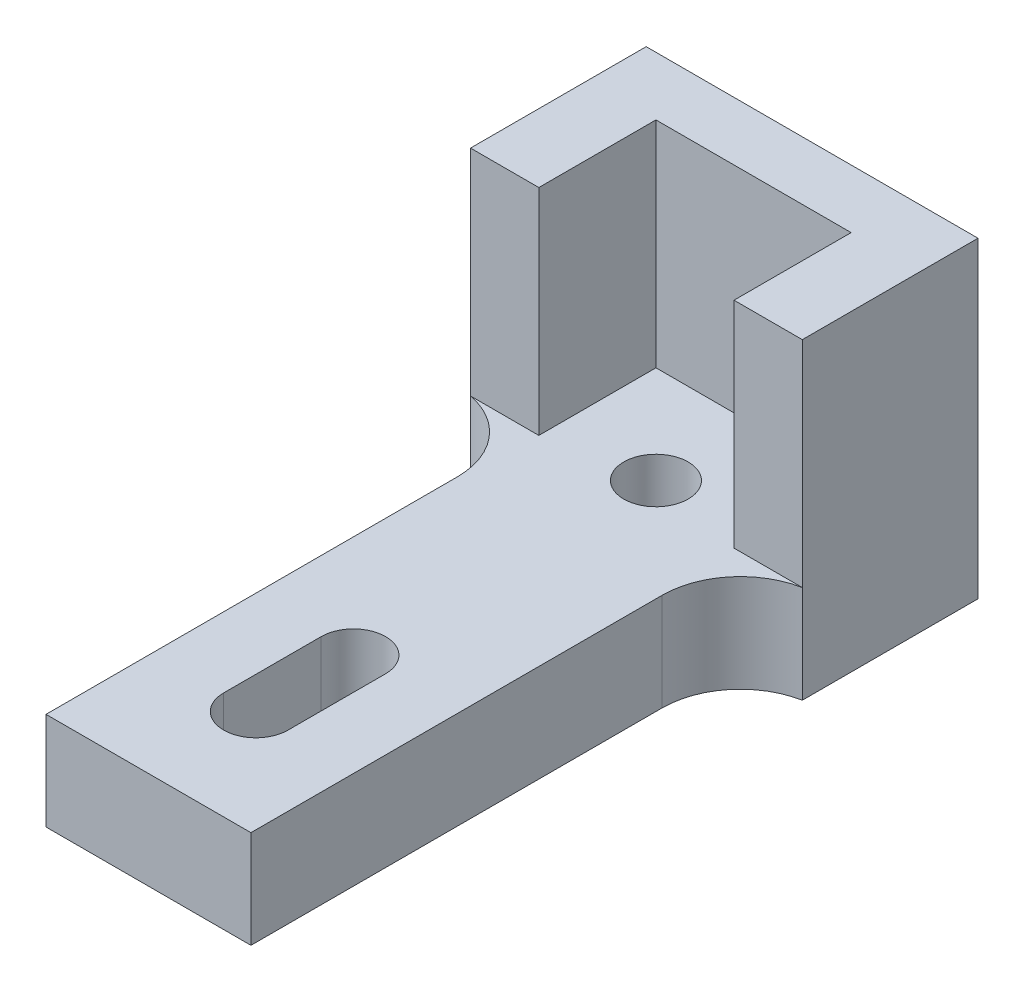
ISO-10303-21;
HEADER;
FILE_DESCRIPTION(('STEP AP214'),'2;1');
FILE_NAME('part.step','',(''),(''),'','','');
FILE_SCHEMA(('AUTOMOTIVE_DESIGN { 1 0 10303 214 1 1 1 1 }'));
ENDSEC;
DATA;
#1=APPLICATION_CONTEXT('core data for automotive mechanical design processes');
#2=APPLICATION_PROTOCOL_DEFINITION('international standard','automotive_design',2000,#1);
#3=PRODUCT_CONTEXT('',#1,'mechanical');
#4=PRODUCT('Part','Part','',(#3));
#5=PRODUCT_RELATED_PRODUCT_CATEGORY('part','',(#4));
#6=PRODUCT_DEFINITION_FORMATION('','',#4);
#7=PRODUCT_DEFINITION_CONTEXT('part definition',#1,'design');
#8=PRODUCT_DEFINITION('design','',#6,#7);
#9=PRODUCT_DEFINITION_SHAPE('','',#8);
#10=(LENGTH_UNIT() NAMED_UNIT(*) SI_UNIT(.MILLI.,.METRE.));
#11=(NAMED_UNIT(*) PLANE_ANGLE_UNIT() SI_UNIT($,.RADIAN.));
#12=(NAMED_UNIT(*) SI_UNIT($,.STERADIAN.) SOLID_ANGLE_UNIT());
#13=UNCERTAINTY_MEASURE_WITH_UNIT(LENGTH_MEASURE(1.E-05),#10,'distance_accuracy_value','');
#14=(GEOMETRIC_REPRESENTATION_CONTEXT(3) GLOBAL_UNCERTAINTY_ASSIGNED_CONTEXT((#13)) GLOBAL_UNIT_ASSIGNED_CONTEXT((#10,
#11,#12)) REPRESENTATION_CONTEXT('',''));
#15=CARTESIAN_POINT('',(0.,0.,0.));
#16=DIRECTION('',(0.,0.,1.));
#17=DIRECTION('',(1.,0.,0.));
#18=AXIS2_PLACEMENT_3D('',#15,#16,#17);
#19=CARTESIAN_POINT('',(0.,0.,0.));
#20=DIRECTION('',(0.,1.,0.));
#21=DIRECTION('',(1.,0.,0.));
#22=AXIS2_PLACEMENT_3D('',#19,#20,#21);
#23=PLANE('',#22);
#24=DIRECTION('',(1.,0.,0.));
#25=VECTOR('',#24,1.);
#26=CARTESIAN_POINT('',(-5.25,0.,26.));
#27=LINE('',#26,#25);
#28=CARTESIAN_POINT('',(-5.25,0.,26.));
#29=VERTEX_POINT('',#28);
#30=CARTESIAN_POINT('',(5.25,0.,26.));
#31=VERTEX_POINT('',#30);
#32=EDGE_CURVE('E36',#29,#31,#27,.T.);
#33=ORIENTED_EDGE('',*,*,#32,.F.);
#34=DIRECTION('',(0.,0.,1.));
#35=VECTOR('',#34,1.);
#36=CARTESIAN_POINT('',(-5.25,0.,4.929058411375));
#37=LINE('',#36,#35);
#38=CARTESIAN_POINT('',(-5.25,0.,4.929058411375));
#39=VERTEX_POINT('',#38);
#40=EDGE_CURVE('E174',#39,#29,#37,.T.);
#41=ORIENTED_EDGE('',*,*,#40,.F.);
#42=CARTESIAN_POINT('',(-9.25,0.,4.929058411375));
#43=DIRECTION('',(0.,1.,0.));
#44=DIRECTION('',(1.,0.,0.));
#45=AXIS2_PLACEMENT_3D('',#42,#43,#44);
#46=CIRCLE('',#45,4.);
#47=CARTESIAN_POINT('',(-8.5,0.,1.));
#48=VERTEX_POINT('',#47);
#49=EDGE_CURVE('E11',#39,#48,#46,.T.);
#50=ORIENTED_EDGE('',*,*,#49,.T.);
#51=DIRECTION('',(0.,0.,1.));
#52=VECTOR('',#51,1.);
#53=CARTESIAN_POINT('',(-8.5,0.,-8.));
#54=LINE('',#53,#52);
#55=CARTESIAN_POINT('',(-8.5,0.,-8.));
#56=VERTEX_POINT('',#55);
#57=EDGE_CURVE('E170',#56,#48,#54,.T.);
#58=ORIENTED_EDGE('',*,*,#57,.F.);
#59=DIRECTION('',(-1.,0.,0.));
#60=VECTOR('',#59,1.);
#61=CARTESIAN_POINT('',(8.5,0.,-8.));
#62=LINE('',#61,#60);
#63=CARTESIAN_POINT('',(8.5,0.,-8.));
#64=VERTEX_POINT('',#63);
#65=EDGE_CURVE('E147',#64,#56,#62,.T.);
#66=ORIENTED_EDGE('',*,*,#65,.F.);
#67=DIRECTION('',(0.,0.,-1.));
#68=VECTOR('',#67,1.);
#69=CARTESIAN_POINT('',(8.5,0.,1.));
#70=LINE('',#69,#68);
#71=CARTESIAN_POINT('',(8.5,0.,1.));
#72=VERTEX_POINT('',#71);
#73=EDGE_CURVE('E153',#72,#64,#70,.T.);
#74=ORIENTED_EDGE('',*,*,#73,.F.);
#75=CARTESIAN_POINT('',(9.25,0.,4.929058411375));
#76=DIRECTION('',(0.,1.,0.));
#77=DIRECTION('',(-0.187499999999992,0.,-0.982264602843859));
#78=AXIS2_PLACEMENT_3D('',#75,#76,#77);
#79=CIRCLE('',#78,4.);
#80=CARTESIAN_POINT('',(5.25,0.,4.929058411375));
#81=VERTEX_POINT('',#80);
#82=EDGE_CURVE('E27',#72,#81,#79,.T.);
#83=ORIENTED_EDGE('',*,*,#82,.T.);
#84=DIRECTION('',(0.,0.,-1.));
#85=VECTOR('',#84,1.);
#86=CARTESIAN_POINT('',(5.25,0.,26.));
#87=LINE('',#86,#85);
#88=EDGE_CURVE('E184',#31,#81,#87,.T.);
#89=ORIENTED_EDGE('',*,*,#88,.F.);
#90=EDGE_LOOP('',(#33,#41,#50,#58,#66,#74,#83,#89));
#91=FACE_BOUND('',#90,.T.);
#92=CARTESIAN_POINT('',(0.,0.,0.));
#93=DIRECTION('',(0.,-1.,0.));
#94=DIRECTION('',(-1.,0.,0.));
#95=AXIS2_PLACEMENT_3D('',#92,#93,#94);
#96=CIRCLE('',#95,1.65);
#97=CARTESIAN_POINT('',(-1.65,0.,0.));
#98=VERTEX_POINT('',#97);
#99=EDGE_CURVE('E195',#98,#98,#96,.T.);
#100=ORIENTED_EDGE('',*,*,#99,.F.);
#101=EDGE_LOOP('',(#100));
#102=FACE_BOUND('',#101,.T.);
#103=DIRECTION('',(0.,0.,1.));
#104=VECTOR('',#103,1.);
#105=CARTESIAN_POINT('',(1.65,0.,15.5));
#106=LINE('',#105,#104);
#107=CARTESIAN_POINT('',(1.65,0.,15.5));
#108=VERTEX_POINT('',#107);
#109=CARTESIAN_POINT('',(1.65,0.,20.5));
#110=VERTEX_POINT('',#109);
#111=EDGE_CURVE('E200',#108,#110,#106,.T.);
#112=ORIENTED_EDGE('',*,*,#111,.F.);
#113=CARTESIAN_POINT('',(0.,0.,15.5));
#114=DIRECTION('',(0.,-1.,0.));
#115=DIRECTION('',(-1.,0.,0.));
#116=AXIS2_PLACEMENT_3D('',#113,#114,#115);
#117=CIRCLE('',#116,1.65);
#118=CARTESIAN_POINT('',(-1.65,0.,15.5));
#119=VERTEX_POINT('',#118);
#120=EDGE_CURVE('E204',#119,#108,#117,.T.);
#121=ORIENTED_EDGE('',*,*,#120,.F.);
#122=DIRECTION('',(0.,0.,-1.));
#123=VECTOR('',#122,1.);
#124=CARTESIAN_POINT('',(-1.65,0.,20.5));
#125=LINE('',#124,#123);
#126=CARTESIAN_POINT('',(-1.65,0.,20.5));
#127=VERTEX_POINT('',#126);
#128=EDGE_CURVE('E207',#127,#119,#125,.T.);
#129=ORIENTED_EDGE('',*,*,#128,.F.);
#130=CARTESIAN_POINT('',(0.,0.,20.5));
#131=DIRECTION('',(0.,-1.,0.));
#132=DIRECTION('',(1.,0.,0.));
#133=AXIS2_PLACEMENT_3D('',#130,#131,#132);
#134=CIRCLE('',#133,1.65);
#135=EDGE_CURVE('E210',#110,#127,#134,.T.);
#136=ORIENTED_EDGE('',*,*,#135,.F.);
#137=EDGE_LOOP('',(#112,#121,#129,#136));
#138=FACE_BOUND('',#137,.T.);
#139=ADVANCED_FACE('F17',(#91,#102,#138),#23,.F.);
#140=CARTESIAN_POINT('',(0.,0.,0.));
#141=DIRECTION('',(0.,1.,0.));
#142=DIRECTION('',(1.,0.,0.));
#143=AXIS2_PLACEMENT_3D('',#140,#141,#142);
#144=CYLINDRICAL_SURFACE('',#143,1.65);
#145=CARTESIAN_POINT('',(0.,5.,0.));
#146=DIRECTION('',(0.,-1.,0.));
#147=DIRECTION('',(1.,0.,0.));
#148=AXIS2_PLACEMENT_3D('',#145,#146,#147);
#149=CIRCLE('',#148,1.65);
#150=CARTESIAN_POINT('',(1.65,5.,0.));
#151=VERTEX_POINT('',#150);
#152=EDGE_CURVE('E214',#151,#151,#149,.T.);
#153=ORIENTED_EDGE('',*,*,#152,.F.);
#154=EDGE_LOOP('',(#153));
#155=FACE_BOUND('',#154,.T.);
#156=ORIENTED_EDGE('',*,*,#99,.T.);
#157=EDGE_LOOP('',(#156));
#158=FACE_BOUND('',#157,.T.);
#159=ADVANCED_FACE('F334',(#155,#158),#144,.F.);
#160=CARTESIAN_POINT('',(0.,5.,0.));
#161=DIRECTION('',(0.,1.,0.));
#162=DIRECTION('',(1.,0.,0.));
#163=AXIS2_PLACEMENT_3D('',#160,#161,#162);
#164=PLANE('',#163);
#165=DIRECTION('',(0.,0.,1.));
#166=VECTOR('',#165,1.);
#167=CARTESIAN_POINT('',(5.,5.,-5.));
#168=LINE('',#167,#166);
#169=CARTESIAN_POINT('',(5.,5.,-5.));
#170=VERTEX_POINT('',#169);
#171=CARTESIAN_POINT('',(5.,5.,1.));
#172=VERTEX_POINT('',#171);
#173=EDGE_CURVE('E219',#170,#172,#168,.T.);
#174=ORIENTED_EDGE('',*,*,#173,.F.);
#175=DIRECTION('',(1.,0.,0.));
#176=VECTOR('',#175,1.);
#177=CARTESIAN_POINT('',(-5.,5.,-5.));
#178=LINE('',#177,#176);
#179=CARTESIAN_POINT('',(-5.,5.,-5.));
#180=VERTEX_POINT('',#179);
#181=EDGE_CURVE('E223',#180,#170,#178,.T.);
#182=ORIENTED_EDGE('',*,*,#181,.F.);
#183=DIRECTION('',(0.,0.,-1.));
#184=VECTOR('',#183,1.);
#185=CARTESIAN_POINT('',(-5.,5.,1.));
#186=LINE('',#185,#184);
#187=CARTESIAN_POINT('',(-5.,5.,1.));
#188=VERTEX_POINT('',#187);
#189=EDGE_CURVE('E226',#188,#180,#186,.T.);
#190=ORIENTED_EDGE('',*,*,#189,.F.);
#191=DIRECTION('',(1.,0.,0.));
#192=VECTOR('',#191,1.);
#193=CARTESIAN_POINT('',(-8.5,5.,1.));
#194=LINE('',#193,#192);
#195=CARTESIAN_POINT('',(-8.5,5.,1.));
#196=VERTEX_POINT('',#195);
#197=EDGE_CURVE('E229',#196,#188,#194,.T.);
#198=ORIENTED_EDGE('',*,*,#197,.F.);
#199=CARTESIAN_POINT('',(-9.25,5.,4.929058411375));
#200=DIRECTION('',(0.,-1.,0.));
#201=DIRECTION('',(0.187499999999992,0.,-0.982264602843859));
#202=AXIS2_PLACEMENT_3D('',#199,#200,#201);
#203=CIRCLE('',#202,4.);
#204=CARTESIAN_POINT('',(-5.25,5.,4.929058411375));
#205=VERTEX_POINT('',#204);
#206=EDGE_CURVE('E199',#196,#205,#203,.T.);
#207=ORIENTED_EDGE('',*,*,#206,.T.);
#208=DIRECTION('',(0.,0.,1.));
#209=VECTOR('',#208,1.);
#210=CARTESIAN_POINT('',(-5.25,5.,4.929058411375));
#211=LINE('',#210,#209);
#212=CARTESIAN_POINT('',(-5.25,5.,26.));
#213=VERTEX_POINT('',#212);
#214=EDGE_CURVE('E233',#205,#213,#211,.T.);
#215=ORIENTED_EDGE('',*,*,#214,.T.);
#216=DIRECTION('',(1.,0.,0.));
#217=VECTOR('',#216,1.);
#218=CARTESIAN_POINT('',(-5.25,5.,26.));
#219=LINE('',#218,#217);
#220=CARTESIAN_POINT('',(5.25,5.,26.));
#221=VERTEX_POINT('',#220);
#222=EDGE_CURVE('E236',#213,#221,#219,.T.);
#223=ORIENTED_EDGE('',*,*,#222,.T.);
#224=DIRECTION('',(0.,0.,-1.));
#225=VECTOR('',#224,1.);
#226=CARTESIAN_POINT('',(5.25,5.,26.));
#227=LINE('',#226,#225);
#228=CARTESIAN_POINT('',(5.25,5.,4.929058411375));
#229=VERTEX_POINT('',#228);
#230=EDGE_CURVE('E239',#221,#229,#227,.T.);
#231=ORIENTED_EDGE('',*,*,#230,.T.);
#232=CARTESIAN_POINT('',(9.25,5.,4.929058411375));
#233=DIRECTION('',(0.,-1.,0.));
#234=DIRECTION('',(-1.,0.,0.));
#235=AXIS2_PLACEMENT_3D('',#232,#233,#234);
#236=CIRCLE('',#235,4.);
#237=CARTESIAN_POINT('',(8.5,5.,1.));
#238=VERTEX_POINT('',#237);
#239=EDGE_CURVE('E217',#229,#238,#236,.T.);
#240=ORIENTED_EDGE('',*,*,#239,.T.);
#241=DIRECTION('',(1.,0.,0.));
#242=VECTOR('',#241,1.);
#243=CARTESIAN_POINT('',(5.,5.,1.));
#244=LINE('',#243,#242);
#245=EDGE_CURVE('E209',#172,#238,#244,.T.);
#246=ORIENTED_EDGE('',*,*,#245,.F.);
#247=EDGE_LOOP('',(#174,#182,#190,#198,#207,#215,#223,#231,#240,#246));
#248=FACE_BOUND('',#247,.T.);
#249=ORIENTED_EDGE('',*,*,#152,.T.);
#250=EDGE_LOOP('',(#249));
#251=FACE_BOUND('',#250,.T.);
#252=DIRECTION('',(0.,0.,-1.));
#253=VECTOR('',#252,1.);
#254=CARTESIAN_POINT('',(-1.65,5.,20.5));
#255=LINE('',#254,#253);
#256=CARTESIAN_POINT('',(-1.65,5.,20.5));
#257=VERTEX_POINT('',#256);
#258=CARTESIAN_POINT('',(-1.65,5.,15.5));
#259=VERTEX_POINT('',#258);
#260=EDGE_CURVE('E218',#257,#259,#255,.T.);
#261=ORIENTED_EDGE('',*,*,#260,.T.);
#262=CARTESIAN_POINT('',(0.,5.,15.5));
#263=DIRECTION('',(0.,-1.,0.));
#264=DIRECTION('',(-1.,0.,0.));
#265=AXIS2_PLACEMENT_3D('',#262,#263,#264);
#266=CIRCLE('',#265,1.65);
#267=CARTESIAN_POINT('',(1.65,5.,15.5));
#268=VERTEX_POINT('',#267);
#269=EDGE_CURVE('E248',#259,#268,#266,.T.);
#270=ORIENTED_EDGE('',*,*,#269,.T.);
#271=DIRECTION('',(0.,0.,1.));
#272=VECTOR('',#271,1.);
#273=CARTESIAN_POINT('',(1.65,5.,15.5));
#274=LINE('',#273,#272);
#275=CARTESIAN_POINT('',(1.65,5.,20.5));
#276=VERTEX_POINT('',#275);
#277=EDGE_CURVE('E251',#268,#276,#274,.T.);
#278=ORIENTED_EDGE('',*,*,#277,.T.);
#279=CARTESIAN_POINT('',(0.,5.,20.5));
#280=DIRECTION('',(0.,-1.,0.));
#281=DIRECTION('',(1.,0.,0.));
#282=AXIS2_PLACEMENT_3D('',#279,#280,#281);
#283=CIRCLE('',#282,1.65);
#284=EDGE_CURVE('E254',#276,#257,#283,.T.);
#285=ORIENTED_EDGE('',*,*,#284,.T.);
#286=EDGE_LOOP('',(#261,#270,#278,#285));
#287=FACE_BOUND('',#286,.T.);
#288=ADVANCED_FACE('F300',(#248,#251,#287),#164,.T.);
#289=CARTESIAN_POINT('',(0.,0.,20.5));
#290=DIRECTION('',(0.,-1.,0.));
#291=DIRECTION('',(0.,0.,1.));
#292=AXIS2_PLACEMENT_3D('',#289,#290,#291);
#293=CYLINDRICAL_SURFACE('',#292,1.65);
#294=DIRECTION('',(0.,1.,0.));
#295=VECTOR('',#294,1.);
#296=CARTESIAN_POINT('',(-1.65,0.,20.5));
#297=LINE('',#296,#295);
#298=EDGE_CURVE('E213',#127,#257,#297,.T.);
#299=ORIENTED_EDGE('',*,*,#298,.T.);
#300=ORIENTED_EDGE('',*,*,#284,.F.);
#301=DIRECTION('',(0.,1.,0.));
#302=VECTOR('',#301,1.);
#303=CARTESIAN_POINT('',(1.65,0.,20.5));
#304=LINE('',#303,#302);
#305=EDGE_CURVE('E202',#110,#276,#304,.T.);
#306=ORIENTED_EDGE('',*,*,#305,.F.);
#307=ORIENTED_EDGE('',*,*,#135,.T.);
#308=EDGE_LOOP('',(#299,#300,#306,#307));
#309=FACE_BOUND('',#308,.T.);
#310=ADVANCED_FACE('F344',(#309),#293,.F.);
#311=CARTESIAN_POINT('',(1.65,0.,15.5));
#312=DIRECTION('',(1.,0.,0.));
#313=DIRECTION('',(0.,0.,1.));
#314=AXIS2_PLACEMENT_3D('',#311,#312,#313);
#315=PLANE('',#314);
#316=ORIENTED_EDGE('',*,*,#305,.T.);
#317=ORIENTED_EDGE('',*,*,#277,.F.);
#318=DIRECTION('',(0.,1.,0.));
#319=VECTOR('',#318,1.);
#320=CARTESIAN_POINT('',(1.65,0.,15.5));
#321=LINE('',#320,#319);
#322=EDGE_CURVE('E203',#108,#268,#321,.T.);
#323=ORIENTED_EDGE('',*,*,#322,.F.);
#324=ORIENTED_EDGE('',*,*,#111,.T.);
#325=EDGE_LOOP('',(#316,#317,#323,#324));
#326=FACE_BOUND('',#325,.T.);
#327=ADVANCED_FACE('F347',(#326),#315,.F.);
#328=CARTESIAN_POINT('',(0.,0.,15.5));
#329=DIRECTION('',(0.,-1.,0.));
#330=DIRECTION('',(0.,0.,1.));
#331=AXIS2_PLACEMENT_3D('',#328,#329,#330);
#332=CYLINDRICAL_SURFACE('',#331,1.65);
#333=ORIENTED_EDGE('',*,*,#322,.T.);
#334=ORIENTED_EDGE('',*,*,#269,.F.);
#335=DIRECTION('',(0.,1.,0.));
#336=VECTOR('',#335,1.);
#337=CARTESIAN_POINT('',(-1.65,0.,15.5));
#338=LINE('',#337,#336);
#339=EDGE_CURVE('E206',#119,#259,#338,.T.);
#340=ORIENTED_EDGE('',*,*,#339,.F.);
#341=ORIENTED_EDGE('',*,*,#120,.T.);
#342=EDGE_LOOP('',(#333,#334,#340,#341));
#343=FACE_BOUND('',#342,.T.);
#344=ADVANCED_FACE('F351',(#343),#332,.F.);
#345=CARTESIAN_POINT('',(-1.65,0.,20.5));
#346=DIRECTION('',(-1.,0.,0.));
#347=DIRECTION('',(0.,0.,-1.));
#348=AXIS2_PLACEMENT_3D('',#345,#346,#347);
#349=PLANE('',#348);
#350=ORIENTED_EDGE('',*,*,#339,.T.);
#351=ORIENTED_EDGE('',*,*,#260,.F.);
#352=ORIENTED_EDGE('',*,*,#298,.F.);
#353=ORIENTED_EDGE('',*,*,#128,.T.);
#354=EDGE_LOOP('',(#350,#351,#352,#353));
#355=FACE_BOUND('',#354,.T.);
#356=ADVANCED_FACE('F355',(#355),#349,.F.);
#357=CARTESIAN_POINT('',(5.25,0.,1.));
#358=DIRECTION('',(0.,0.,1.));
#359=DIRECTION('',(1.,0.,0.));
#360=AXIS2_PLACEMENT_3D('',#357,#358,#359);
#361=PLANE('',#360);
#362=DIRECTION('',(0.,-1.,0.));
#363=VECTOR('',#362,1.);
#364=CARTESIAN_POINT('',(8.5,16.,1.));
#365=LINE('',#364,#363);
#366=CARTESIAN_POINT('',(8.5,16.,1.));
#367=VERTEX_POINT('',#366);
#368=EDGE_CURVE('E154',#367,#238,#365,.T.);
#369=ORIENTED_EDGE('',*,*,#368,.F.);
#370=DIRECTION('',(1.,0.,0.));
#371=VECTOR('',#370,1.);
#372=CARTESIAN_POINT('',(5.,16.,1.));
#373=LINE('',#372,#371);
#374=CARTESIAN_POINT('',(5.,16.,1.));
#375=VERTEX_POINT('',#374);
#376=EDGE_CURVE('E144',#375,#367,#373,.T.);
#377=ORIENTED_EDGE('',*,*,#376,.F.);
#378=DIRECTION('',(0.,1.,0.));
#379=VECTOR('',#378,1.);
#380=CARTESIAN_POINT('',(5.,5.,1.));
#381=LINE('',#380,#379);
#382=EDGE_CURVE('E221',#172,#375,#381,.T.);
#383=ORIENTED_EDGE('',*,*,#382,.F.);
#384=ORIENTED_EDGE('',*,*,#245,.T.);
#385=EDGE_LOOP('',(#369,#377,#383,#384));
#386=FACE_BOUND('',#385,.T.);
#387=ADVANCED_FACE('F298',(#386),#361,.T.);
#388=CARTESIAN_POINT('',(5.,5.,-5.));
#389=DIRECTION('',(-1.,0.,0.));
#390=DIRECTION('',(0.,0.,1.));
#391=AXIS2_PLACEMENT_3D('',#388,#389,#390);
#392=PLANE('',#391);
#393=ORIENTED_EDGE('',*,*,#382,.T.);
#394=DIRECTION('',(0.,0.,1.));
#395=VECTOR('',#394,1.);
#396=CARTESIAN_POINT('',(5.,16.,-5.));
#397=LINE('',#396,#395);
#398=CARTESIAN_POINT('',(5.,16.,-5.));
#399=VERTEX_POINT('',#398);
#400=EDGE_CURVE('E265',#399,#375,#397,.T.);
#401=ORIENTED_EDGE('',*,*,#400,.F.);
#402=DIRECTION('',(0.,1.,0.));
#403=VECTOR('',#402,1.);
#404=CARTESIAN_POINT('',(5.,5.,-5.));
#405=LINE('',#404,#403);
#406=EDGE_CURVE('E222',#170,#399,#405,.T.);
#407=ORIENTED_EDGE('',*,*,#406,.F.);
#408=ORIENTED_EDGE('',*,*,#173,.T.);
#409=EDGE_LOOP('',(#393,#401,#407,#408));
#410=FACE_BOUND('',#409,.T.);
#411=ADVANCED_FACE('F294',(#410),#392,.T.);
#412=CARTESIAN_POINT('',(-5.,5.,-5.));
#413=DIRECTION('',(0.,0.,1.));
#414=DIRECTION('',(1.,0.,0.));
#415=AXIS2_PLACEMENT_3D('',#412,#413,#414);
#416=PLANE('',#415);
#417=ORIENTED_EDGE('',*,*,#406,.T.);
#418=DIRECTION('',(1.,0.,0.));
#419=VECTOR('',#418,1.);
#420=CARTESIAN_POINT('',(-5.,16.,-5.));
#421=LINE('',#420,#419);
#422=CARTESIAN_POINT('',(-5.,16.,-5.));
#423=VERTEX_POINT('',#422);
#424=EDGE_CURVE('E269',#423,#399,#421,.T.);
#425=ORIENTED_EDGE('',*,*,#424,.F.);
#426=DIRECTION('',(0.,1.,0.));
#427=VECTOR('',#426,1.);
#428=CARTESIAN_POINT('',(-5.,5.,-5.));
#429=LINE('',#428,#427);
#430=EDGE_CURVE('E225',#180,#423,#429,.T.);
#431=ORIENTED_EDGE('',*,*,#430,.F.);
#432=ORIENTED_EDGE('',*,*,#181,.T.);
#433=EDGE_LOOP('',(#417,#425,#431,#432));
#434=FACE_BOUND('',#433,.T.);
#435=ADVANCED_FACE('F290',(#434),#416,.T.);
#436=CARTESIAN_POINT('',(-5.,5.,1.));
#437=DIRECTION('',(1.,0.,0.));
#438=DIRECTION('',(0.,0.,-1.));
#439=AXIS2_PLACEMENT_3D('',#436,#437,#438);
#440=PLANE('',#439);
#441=ORIENTED_EDGE('',*,*,#430,.T.);
#442=DIRECTION('',(0.,0.,-1.));
#443=VECTOR('',#442,1.);
#444=CARTESIAN_POINT('',(-5.,16.,1.));
#445=LINE('',#444,#443);
#446=CARTESIAN_POINT('',(-5.,16.,1.));
#447=VERTEX_POINT('',#446);
#448=EDGE_CURVE('E161',#447,#423,#445,.T.);
#449=ORIENTED_EDGE('',*,*,#448,.F.);
#450=DIRECTION('',(0.,1.,0.));
#451=VECTOR('',#450,1.);
#452=CARTESIAN_POINT('',(-5.,5.,1.));
#453=LINE('',#452,#451);
#454=EDGE_CURVE('E228',#188,#447,#453,.T.);
#455=ORIENTED_EDGE('',*,*,#454,.F.);
#456=ORIENTED_EDGE('',*,*,#189,.T.);
#457=EDGE_LOOP('',(#441,#449,#455,#456));
#458=FACE_BOUND('',#457,.T.);
#459=ADVANCED_FACE('F286',(#458),#440,.T.);
#460=CARTESIAN_POINT('',(-8.5,0.,1.));
#461=DIRECTION('',(0.,0.,1.));
#462=DIRECTION('',(1.,0.,0.));
#463=AXIS2_PLACEMENT_3D('',#460,#461,#462);
#464=PLANE('',#463);
#465=ORIENTED_EDGE('',*,*,#454,.T.);
#466=DIRECTION('',(1.,0.,0.));
#467=VECTOR('',#466,1.);
#468=CARTESIAN_POINT('',(-8.5,16.,1.));
#469=LINE('',#468,#467);
#470=CARTESIAN_POINT('',(-8.5,16.,1.));
#471=VERTEX_POINT('',#470);
#472=EDGE_CURVE('E158',#471,#447,#469,.T.);
#473=ORIENTED_EDGE('',*,*,#472,.F.);
#474=DIRECTION('',(0.,1.,0.));
#475=VECTOR('',#474,1.);
#476=CARTESIAN_POINT('',(-8.5,5.,1.));
#477=LINE('',#476,#475);
#478=EDGE_CURVE('E165',#196,#471,#477,.T.);
#479=ORIENTED_EDGE('',*,*,#478,.F.);
#480=ORIENTED_EDGE('',*,*,#197,.T.);
#481=EDGE_LOOP('',(#465,#473,#479,#480));
#482=FACE_BOUND('',#481,.T.);
#483=ADVANCED_FACE('F281',(#482),#464,.T.);
#484=CARTESIAN_POINT('',(-8.5,0.,-8.));
#485=DIRECTION('',(-1.,0.,0.));
#486=DIRECTION('',(0.,0.,1.));
#487=AXIS2_PLACEMENT_3D('',#484,#485,#486);
#488=PLANE('',#487);
#489=ORIENTED_EDGE('',*,*,#478,.T.);
#490=DIRECTION('',(0.,0.,1.));
#491=VECTOR('',#490,1.);
#492=CARTESIAN_POINT('',(-8.5,16.,-8.));
#493=LINE('',#492,#491);
#494=CARTESIAN_POINT('',(-8.5,16.,-8.));
#495=VERTEX_POINT('',#494);
#496=EDGE_CURVE('E156',#495,#471,#493,.T.);
#497=ORIENTED_EDGE('',*,*,#496,.F.);
#498=DIRECTION('',(0.,1.,0.));
#499=VECTOR('',#498,1.);
#500=CARTESIAN_POINT('',(-8.5,0.,-8.));
#501=LINE('',#500,#499);
#502=EDGE_CURVE('E133',#56,#495,#501,.T.);
#503=ORIENTED_EDGE('',*,*,#502,.F.);
#504=ORIENTED_EDGE('',*,*,#57,.T.);
#505=DIRECTION('',(0.,1.,0.));
#506=VECTOR('',#505,1.);
#507=CARTESIAN_POINT('',(-8.5,0.,1.));
#508=LINE('',#507,#506);
#509=EDGE_CURVE('E167',#48,#196,#508,.T.);
#510=ORIENTED_EDGE('',*,*,#509,.T.);
#511=EDGE_LOOP('',(#489,#497,#503,#504,#510));
#512=FACE_BOUND('',#511,.T.);
#513=ADVANCED_FACE('F312',(#512),#488,.T.);
#514=CARTESIAN_POINT('',(-9.25,-21.03612688411,4.929058411375));
#515=DIRECTION('',(0.,1.,0.));
#516=DIRECTION('',(1.,0.,0.));
#517=AXIS2_PLACEMENT_3D('',#514,#515,#516);
#518=CYLINDRICAL_SURFACE('',#517,4.);
#519=ORIENTED_EDGE('',*,*,#206,.F.);
#520=ORIENTED_EDGE('',*,*,#509,.F.);
#521=ORIENTED_EDGE('',*,*,#49,.F.);
#522=DIRECTION('',(0.,1.,0.));
#523=VECTOR('',#522,1.);
#524=CARTESIAN_POINT('',(-5.25,0.,4.929058411375));
#525=LINE('',#524,#523);
#526=EDGE_CURVE('E171',#39,#205,#525,.T.);
#527=ORIENTED_EDGE('',*,*,#526,.T.);
#528=EDGE_LOOP('',(#519,#520,#521,#527));
#529=FACE_BOUND('',#528,.T.);
#530=ADVANCED_FACE('F315',(#529),#518,.F.);
#531=CARTESIAN_POINT('',(-5.25,0.,1.));
#532=DIRECTION('',(-1.,0.,0.));
#533=DIRECTION('',(0.,0.,1.));
#534=AXIS2_PLACEMENT_3D('',#531,#532,#533);
#535=PLANE('',#534);
#536=ORIENTED_EDGE('',*,*,#40,.T.);
#537=DIRECTION('',(0.,1.,0.));
#538=VECTOR('',#537,1.);
#539=CARTESIAN_POINT('',(-5.25,0.,26.));
#540=LINE('',#539,#538);
#541=EDGE_CURVE('E175',#29,#213,#540,.T.);
#542=ORIENTED_EDGE('',*,*,#541,.T.);
#543=ORIENTED_EDGE('',*,*,#214,.F.);
#544=ORIENTED_EDGE('',*,*,#526,.F.);
#545=EDGE_LOOP('',(#536,#542,#543,#544));
#546=FACE_BOUND('',#545,.T.);
#547=ADVANCED_FACE('F318',(#546),#535,.T.);
#548=CARTESIAN_POINT('',(-5.25,0.,26.));
#549=DIRECTION('',(0.,0.,1.));
#550=DIRECTION('',(1.,0.,0.));
#551=AXIS2_PLACEMENT_3D('',#548,#549,#550);
#552=PLANE('',#551);
#553=DIRECTION('',(0.,1.,0.));
#554=VECTOR('',#553,1.);
#555=CARTESIAN_POINT('',(5.25,0.,26.));
#556=LINE('',#555,#554);
#557=EDGE_CURVE('E178',#31,#221,#556,.T.);
#558=ORIENTED_EDGE('',*,*,#557,.T.);
#559=ORIENTED_EDGE('',*,*,#222,.F.);
#560=ORIENTED_EDGE('',*,*,#541,.F.);
#561=ORIENTED_EDGE('',*,*,#32,.T.);
#562=EDGE_LOOP('',(#558,#559,#560,#561));
#563=FACE_BOUND('',#562,.T.);
#564=ADVANCED_FACE('F321',(#563),#552,.T.);
#565=CARTESIAN_POINT('',(5.25,0.,26.));
#566=DIRECTION('',(1.,0.,0.));
#567=DIRECTION('',(0.,0.,-1.));
#568=AXIS2_PLACEMENT_3D('',#565,#566,#567);
#569=PLANE('',#568);
#570=ORIENTED_EDGE('',*,*,#230,.F.);
#571=ORIENTED_EDGE('',*,*,#557,.F.);
#572=ORIENTED_EDGE('',*,*,#88,.T.);
#573=DIRECTION('',(0.,1.,0.));
#574=VECTOR('',#573,1.);
#575=CARTESIAN_POINT('',(5.25,0.,4.929058411375));
#576=LINE('',#575,#574);
#577=EDGE_CURVE('E181',#81,#229,#576,.T.);
#578=ORIENTED_EDGE('',*,*,#577,.T.);
#579=EDGE_LOOP('',(#570,#571,#572,#578));
#580=FACE_BOUND('',#579,.T.);
#581=ADVANCED_FACE('F305',(#580),#569,.T.);
#582=CARTESIAN_POINT('',(9.25,-21.03612688411,4.929058411375));
#583=DIRECTION('',(0.,1.,0.));
#584=DIRECTION('',(-0.187499999999992,0.,-0.982264602843859));
#585=AXIS2_PLACEMENT_3D('',#582,#583,#584);
#586=CYLINDRICAL_SURFACE('',#585,4.);
#587=ORIENTED_EDGE('',*,*,#239,.F.);
#588=ORIENTED_EDGE('',*,*,#577,.F.);
#589=ORIENTED_EDGE('',*,*,#82,.F.);
#590=DIRECTION('',(0.,1.,0.));
#591=VECTOR('',#590,1.);
#592=CARTESIAN_POINT('',(8.5,0.,1.));
#593=LINE('',#592,#591);
#594=EDGE_CURVE('E185',#72,#238,#593,.T.);
#595=ORIENTED_EDGE('',*,*,#594,.T.);
#596=EDGE_LOOP('',(#587,#588,#589,#595));
#597=FACE_BOUND('',#596,.T.);
#598=ADVANCED_FACE('F303',(#597),#586,.F.);
#599=CARTESIAN_POINT('',(8.5,0.,1.));
#600=DIRECTION('',(1.,0.,0.));
#601=DIRECTION('',(0.,0.,-1.));
#602=AXIS2_PLACEMENT_3D('',#599,#600,#601);
#603=PLANE('',#602);
#604=ORIENTED_EDGE('',*,*,#73,.T.);
#605=DIRECTION('',(0.,1.,0.));
#606=VECTOR('',#605,1.);
#607=CARTESIAN_POINT('',(8.5,0.,-8.));
#608=LINE('',#607,#606);
#609=CARTESIAN_POINT('',(8.5,16.,-8.));
#610=VERTEX_POINT('',#609);
#611=EDGE_CURVE('E150',#64,#610,#608,.T.);
#612=ORIENTED_EDGE('',*,*,#611,.T.);
#613=DIRECTION('',(0.,0.,-1.));
#614=VECTOR('',#613,1.);
#615=CARTESIAN_POINT('',(8.5,16.,1.));
#616=LINE('',#615,#614);
#617=EDGE_CURVE('E139',#367,#610,#616,.T.);
#618=ORIENTED_EDGE('',*,*,#617,.F.);
#619=ORIENTED_EDGE('',*,*,#368,.T.);
#620=ORIENTED_EDGE('',*,*,#594,.F.);
#621=EDGE_LOOP('',(#604,#612,#618,#619,#620));
#622=FACE_BOUND('',#621,.T.);
#623=ADVANCED_FACE('F151',(#622),#603,.T.);
#624=CARTESIAN_POINT('',(0.,16.,0.));
#625=DIRECTION('',(0.,1.,0.));
#626=DIRECTION('',(1.,0.,0.));
#627=AXIS2_PLACEMENT_3D('',#624,#625,#626);
#628=PLANE('',#627);
#629=DIRECTION('',(-1.,0.,0.));
#630=VECTOR('',#629,1.);
#631=CARTESIAN_POINT('',(8.5,16.,-8.));
#632=LINE('',#631,#630);
#633=EDGE_CURVE('E21',#610,#495,#632,.T.);
#634=ORIENTED_EDGE('',*,*,#633,.T.);
#635=ORIENTED_EDGE('',*,*,#496,.T.);
#636=ORIENTED_EDGE('',*,*,#472,.T.);
#637=ORIENTED_EDGE('',*,*,#448,.T.);
#638=ORIENTED_EDGE('',*,*,#424,.T.);
#639=ORIENTED_EDGE('',*,*,#400,.T.);
#640=ORIENTED_EDGE('',*,*,#376,.T.);
#641=ORIENTED_EDGE('',*,*,#617,.T.);
#642=EDGE_LOOP('',(#634,#635,#636,#637,#638,#639,#640,#641));
#643=FACE_BOUND('',#642,.T.);
#644=ADVANCED_FACE('F141',(#643),#628,.T.);
#645=CARTESIAN_POINT('',(8.5,0.,-8.));
#646=DIRECTION('',(0.,0.,-1.));
#647=DIRECTION('',(-1.,0.,0.));
#648=AXIS2_PLACEMENT_3D('',#645,#646,#647);
#649=PLANE('',#648);
#650=ORIENTED_EDGE('',*,*,#65,.T.);
#651=ORIENTED_EDGE('',*,*,#502,.T.);
#652=ORIENTED_EDGE('',*,*,#633,.F.);
#653=ORIENTED_EDGE('',*,*,#611,.F.);
#654=EDGE_LOOP('',(#650,#651,#652,#653));
#655=FACE_BOUND('',#654,.T.);
#656=ADVANCED_FACE('F19',(#655),#649,.T.);
#657=CLOSED_SHELL('',(#139,#159,#288,#310,#327,#344,#356,#387,#411,#435,#459,#483,#513,#530,
#547,#564,#581,#598,#623,#644,#656));
#658=MANIFOLD_SOLID_BREP('B1',#657);
#659=ADVANCED_BREP_SHAPE_REPRESENTATION('',(#18,#658),#14);
#660=SHAPE_DEFINITION_REPRESENTATION(#9,#659);
ENDSEC;
END-ISO-10303-21;
